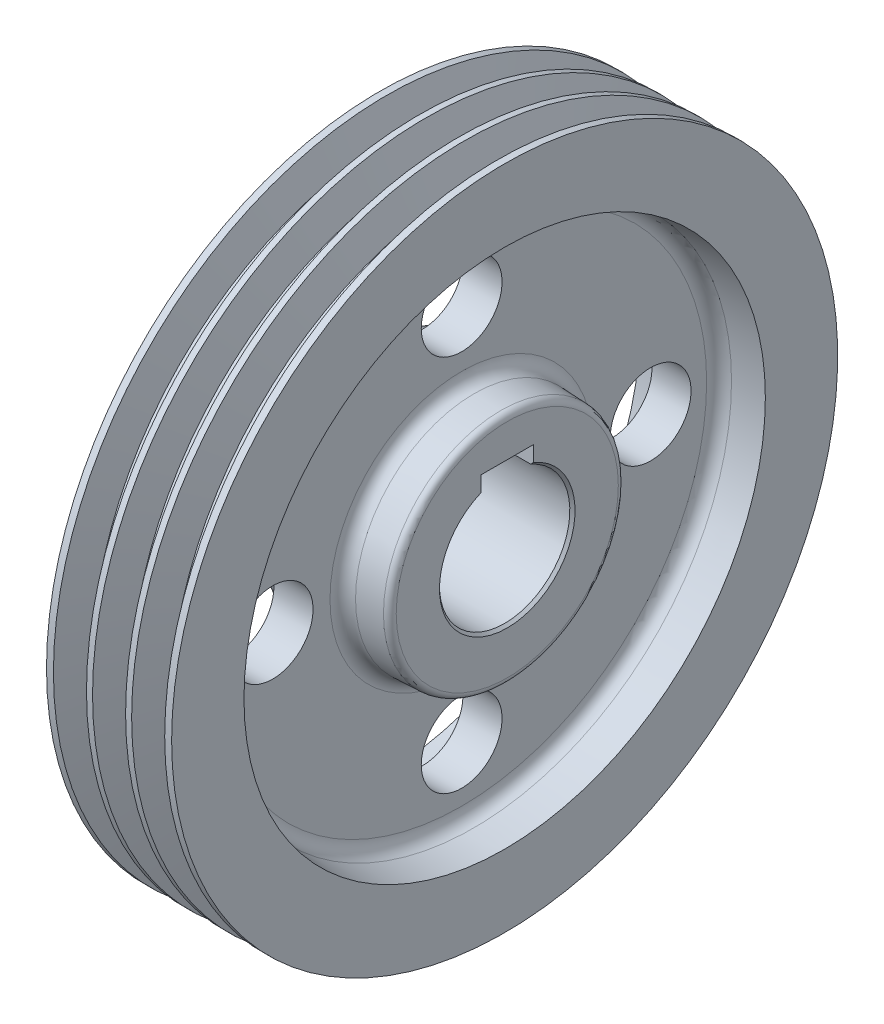
ISO-10303-21;
HEADER;
FILE_DESCRIPTION(('STEP AP214'),'2;1');
FILE_NAME('part.step','',(''),(''),'','','');
FILE_SCHEMA(('AUTOMOTIVE_DESIGN { 1 0 10303 214 1 1 1 1 }'));
ENDSEC;
DATA;
#1=APPLICATION_CONTEXT('core data for automotive mechanical design processes');
#2=APPLICATION_PROTOCOL_DEFINITION('international standard','automotive_design',2000,#1);
#3=PRODUCT_CONTEXT('',#1,'mechanical');
#4=PRODUCT('Part','Part','',(#3));
#5=PRODUCT_RELATED_PRODUCT_CATEGORY('part','',(#4));
#6=PRODUCT_DEFINITION_FORMATION('','',#4);
#7=PRODUCT_DEFINITION_CONTEXT('part definition',#1,'design');
#8=PRODUCT_DEFINITION('design','',#6,#7);
#9=PRODUCT_DEFINITION_SHAPE('','',#8);
#10=(LENGTH_UNIT() NAMED_UNIT(*) SI_UNIT(.MILLI.,.METRE.));
#11=(NAMED_UNIT(*) PLANE_ANGLE_UNIT() SI_UNIT($,.RADIAN.));
#12=(NAMED_UNIT(*) SI_UNIT($,.STERADIAN.) SOLID_ANGLE_UNIT());
#13=UNCERTAINTY_MEASURE_WITH_UNIT(LENGTH_MEASURE(1.E-05),#10,'distance_accuracy_value','');
#14=(GEOMETRIC_REPRESENTATION_CONTEXT(3) GLOBAL_UNCERTAINTY_ASSIGNED_CONTEXT((#13)) GLOBAL_UNIT_ASSIGNED_CONTEXT((#10,
#11,#12)) REPRESENTATION_CONTEXT('',''));
#15=CARTESIAN_POINT('',(0.,0.,0.));
#16=DIRECTION('',(0.,0.,1.));
#17=DIRECTION('',(1.,0.,0.));
#18=AXIS2_PLACEMENT_3D('',#15,#16,#17);
#19=CARTESIAN_POINT('',(16.5,46.5310516117034,0.));
#20=DIRECTION('',(1.,0.,0.));
#21=DIRECTION('',(0.,0.,-1.));
#22=AXIS2_PLACEMENT_3D('',#19,#20,#21);
#23=PLANE('',#22);
#24=CARTESIAN_POINT('',(16.5,-72.5,5.06264794132254E-13));
#25=DIRECTION('',(1.,0.,0.));
#26=DIRECTION('',(0.,0.,-1.));
#27=AXIS2_PLACEMENT_3D('',#24,#25,#26);
#28=CIRCLE('',#27,15.5);
#29=CARTESIAN_POINT('',(16.5,-72.5,-15.4999999999995));
#30=VERTEX_POINT('',#29);
#31=EDGE_CURVE('E330',#30,#30,#28,.F.);
#32=ORIENTED_EDGE('',*,*,#31,.F.);
#33=EDGE_LOOP('',(#32));
#34=FACE_BOUND('',#33,.T.);
#35=CARTESIAN_POINT('',(16.5,72.5,0.));
#36=DIRECTION('',(1.,0.,0.));
#37=DIRECTION('',(0.,0.,-1.));
#38=AXIS2_PLACEMENT_3D('',#35,#36,#37);
#39=CIRCLE('',#38,15.5);
#40=CARTESIAN_POINT('',(16.5,72.5,-15.5));
#41=VERTEX_POINT('',#40);
#42=EDGE_CURVE('E116',#41,#41,#39,.F.);
#43=ORIENTED_EDGE('',*,*,#42,.F.);
#44=EDGE_LOOP('',(#43));
#45=FACE_BOUND('',#44,.T.);
#46=CARTESIAN_POINT('',(16.5,0.,0.));
#47=DIRECTION('',(1.,0.,0.));
#48=DIRECTION('',(0.,0.,-1.));
#49=AXIS2_PLACEMENT_3D('',#46,#47,#48);
#50=CIRCLE('',#49,51.1127074817906);
#51=CARTESIAN_POINT('',(16.5,0.,-51.1127074817906));
#52=VERTEX_POINT('',#51);
#53=EDGE_CURVE('E296',#52,#52,#50,.T.);
#54=ORIENTED_EDGE('',*,*,#53,.T.);
#55=EDGE_LOOP('',(#54));
#56=FACE_BOUND('',#55,.T.);
#57=CARTESIAN_POINT('',(16.5,0.,0.));
#58=DIRECTION('',(1.,0.,0.));
#59=DIRECTION('',(0.,0.,-1.));
#60=AXIS2_PLACEMENT_3D('',#57,#58,#59);
#61=CIRCLE('',#60,94.5361263688525);
#62=CARTESIAN_POINT('',(16.5,0.,-94.5361263688525));
#63=VERTEX_POINT('',#62);
#64=EDGE_CURVE('E292',#63,#63,#61,.F.);
#65=ORIENTED_EDGE('',*,*,#64,.T.);
#66=EDGE_LOOP('',(#65));
#67=FACE_BOUND('',#66,.T.);
#68=CARTESIAN_POINT('',(16.5,-2.53132397066127E-13,-72.5));
#69=DIRECTION('',(1.,0.,0.));
#70=DIRECTION('',(0.,0.,-1.));
#71=AXIS2_PLACEMENT_3D('',#68,#69,#70);
#72=CIRCLE('',#71,15.5);
#73=CARTESIAN_POINT('',(16.5,-2.53132397066127E-13,-88.));
#74=VERTEX_POINT('',#73);
#75=EDGE_CURVE('E327',#74,#74,#72,.F.);
#76=ORIENTED_EDGE('',*,*,#75,.F.);
#77=EDGE_LOOP('',(#76));
#78=FACE_BOUND('',#77,.T.);
#79=CARTESIAN_POINT('',(16.5,7.59397191198382E-13,72.5));
#80=DIRECTION('',(1.,0.,0.));
#81=DIRECTION('',(0.,0.,-1.));
#82=AXIS2_PLACEMENT_3D('',#79,#80,#81);
#83=CIRCLE('',#82,15.5);
#84=CARTESIAN_POINT('',(16.5,7.59397191198382E-13,57.));
#85=VERTEX_POINT('',#84);
#86=EDGE_CURVE('E333',#85,#85,#83,.F.);
#87=ORIENTED_EDGE('',*,*,#86,.F.);
#88=EDGE_LOOP('',(#87));
#89=FACE_BOUND('',#88,.T.);
#90=ADVANCED_FACE('F33',(#34,#45,#56,#67,#78,#89),#23,.F.);
#91=CARTESIAN_POINT('',(31.5,98.5564370518225,0.));
#92=DIRECTION('',(-1.,0.,0.));
#93=DIRECTION('',(0.,0.,1.));
#94=AXIS2_PLACEMENT_3D('',#91,#92,#93);
#95=PLANE('',#94);
#96=CARTESIAN_POINT('',(31.5,-72.5,5.06264794132254E-13));
#97=DIRECTION('',(-1.,0.,0.));
#98=DIRECTION('',(0.,0.,1.));
#99=AXIS2_PLACEMENT_3D('',#96,#97,#98);
#100=CIRCLE('',#99,15.5);
#101=CARTESIAN_POINT('',(31.5,-72.5,15.5000000000005));
#102=VERTEX_POINT('',#101);
#103=EDGE_CURVE('E331',#102,#102,#100,.F.);
#104=ORIENTED_EDGE('',*,*,#103,.F.);
#105=EDGE_LOOP('',(#104));
#106=FACE_BOUND('',#105,.T.);
#107=CARTESIAN_POINT('',(31.5,72.5,0.));
#108=DIRECTION('',(-1.,0.,0.));
#109=DIRECTION('',(0.,0.,1.));
#110=AXIS2_PLACEMENT_3D('',#107,#108,#109);
#111=CIRCLE('',#110,15.5);
#112=CARTESIAN_POINT('',(31.5,72.5,15.5));
#113=VERTEX_POINT('',#112);
#114=EDGE_CURVE('E324',#113,#113,#111,.F.);
#115=ORIENTED_EDGE('',*,*,#114,.F.);
#116=EDGE_LOOP('',(#115));
#117=FACE_BOUND('',#116,.T.);
#118=CARTESIAN_POINT('',(31.5,0.,0.));
#119=DIRECTION('',(-1.,0.,0.));
#120=DIRECTION('',(0.,0.,1.));
#121=AXIS2_PLACEMENT_3D('',#118,#119,#120);
#122=CIRCLE('',#121,50.5038629668638);
#123=CARTESIAN_POINT('',(31.5,0.,50.5038629668638));
#124=VERTEX_POINT('',#123);
#125=EDGE_CURVE('E307',#124,#124,#122,.T.);
#126=ORIENTED_EDGE('',*,*,#125,.T.);
#127=EDGE_LOOP('',(#126));
#128=FACE_BOUND('',#127,.T.);
#129=CARTESIAN_POINT('',(31.5,0.,0.));
#130=DIRECTION('',(-1.,0.,0.));
#131=DIRECTION('',(0.,0.,1.));
#132=AXIS2_PLACEMENT_3D('',#129,#130,#131);
#133=CIRCLE('',#132,93.9747811817353);
#134=CARTESIAN_POINT('',(31.5,0.,93.9747811817353));
#135=VERTEX_POINT('',#134);
#136=EDGE_CURVE('E304',#135,#135,#133,.F.);
#137=ORIENTED_EDGE('',*,*,#136,.T.);
#138=EDGE_LOOP('',(#137));
#139=FACE_BOUND('',#138,.T.);
#140=CARTESIAN_POINT('',(31.5,-2.53132397066127E-13,-72.5));
#141=DIRECTION('',(-1.,0.,0.));
#142=DIRECTION('',(0.,0.,1.));
#143=AXIS2_PLACEMENT_3D('',#140,#141,#142);
#144=CIRCLE('',#143,15.5);
#145=CARTESIAN_POINT('',(31.5,-2.53132397066127E-13,-57.));
#146=VERTEX_POINT('',#145);
#147=EDGE_CURVE('E328',#146,#146,#144,.F.);
#148=ORIENTED_EDGE('',*,*,#147,.F.);
#149=EDGE_LOOP('',(#148));
#150=FACE_BOUND('',#149,.T.);
#151=CARTESIAN_POINT('',(31.5,7.59397191198382E-13,72.5));
#152=DIRECTION('',(-1.,0.,0.));
#153=DIRECTION('',(0.,0.,1.));
#154=AXIS2_PLACEMENT_3D('',#151,#152,#153);
#155=CIRCLE('',#154,15.5);
#156=CARTESIAN_POINT('',(31.5,7.59397191198382E-13,88.));
#157=VERTEX_POINT('',#156);
#158=EDGE_CURVE('E37',#157,#157,#155,.F.);
#159=ORIENTED_EDGE('',*,*,#158,.F.);
#160=EDGE_LOOP('',(#159));
#161=FACE_BOUND('',#160,.T.);
#162=ADVANCED_FACE('F193',(#106,#117,#128,#139,#150,#161),#95,.F.);
#163=CARTESIAN_POINT('',(0.,0.,0.));
#164=DIRECTION('',(-1.,0.,0.));
#165=DIRECTION('',(0.,0.,1.));
#166=AXIS2_PLACEMENT_3D('',#163,#164,#165);
#167=CYLINDRICAL_SURFACE('',#166,127.75);
#168=CARTESIAN_POINT('',(48.,0.,0.));
#169=DIRECTION('',(-1.,0.,0.));
#170=DIRECTION('',(0.,0.,1.));
#171=AXIS2_PLACEMENT_3D('',#168,#169,#170);
#172=CIRCLE('',#171,127.75);
#173=CARTESIAN_POINT('',(48.,0.,127.75));
#174=VERTEX_POINT('',#173);
#175=EDGE_CURVE('E245',#174,#174,#172,.T.);
#176=ORIENTED_EDGE('',*,*,#175,.T.);
#177=EDGE_LOOP('',(#176));
#178=FACE_BOUND('',#177,.T.);
#179=CARTESIAN_POINT('',(45.3407593740113,0.,0.));
#180=DIRECTION('',(-1.,0.,0.));
#181=DIRECTION('',(0.,0.,1.));
#182=AXIS2_PLACEMENT_3D('',#179,#180,#181);
#183=CIRCLE('',#182,127.75);
#184=CARTESIAN_POINT('',(45.3407593740113,0.,127.75));
#185=VERTEX_POINT('',#184);
#186=EDGE_CURVE('E278',#185,#185,#183,.T.);
#187=ORIENTED_EDGE('',*,*,#186,.F.);
#188=EDGE_LOOP('',(#187));
#189=FACE_BOUND('',#188,.T.);
#190=ADVANCED_FACE('F199',(#178,#189),#167,.T.);
#191=CARTESIAN_POINT('',(30.3407593740113,0.,0.));
#192=DIRECTION('',(-1.,0.,0.));
#193=DIRECTION('',(0.,0.,1.));
#194=AXIS2_PLACEMENT_3D('',#191,#192,#193);
#195=CIRCLE('',#194,127.75);
#196=CARTESIAN_POINT('',(30.3407593740113,0.,127.75));
#197=VERTEX_POINT('',#196);
#198=EDGE_CURVE('E266',#197,#197,#195,.T.);
#199=ORIENTED_EDGE('',*,*,#198,.F.);
#200=EDGE_LOOP('',(#199));
#201=FACE_BOUND('',#200,.T.);
#202=CARTESIAN_POINT('',(32.6592406259887,0.,0.));
#203=DIRECTION('',(-1.,0.,0.));
#204=DIRECTION('',(0.,0.,1.));
#205=AXIS2_PLACEMENT_3D('',#202,#203,#204);
#206=CIRCLE('',#205,127.75);
#207=CARTESIAN_POINT('',(32.6592406259887,0.,127.75));
#208=VERTEX_POINT('',#207);
#209=EDGE_CURVE('E281',#208,#208,#206,.T.);
#210=ORIENTED_EDGE('',*,*,#209,.T.);
#211=EDGE_LOOP('',(#210));
#212=FACE_BOUND('',#211,.T.);
#213=ADVANCED_FACE('F543',(#201,#212),#167,.T.);
#214=CARTESIAN_POINT('',(15.3407593740113,0.,0.));
#215=DIRECTION('',(-1.,0.,0.));
#216=DIRECTION('',(0.,0.,1.));
#217=AXIS2_PLACEMENT_3D('',#214,#215,#216);
#218=CIRCLE('',#217,127.75);
#219=CARTESIAN_POINT('',(15.3407593740113,0.,127.75));
#220=VERTEX_POINT('',#219);
#221=EDGE_CURVE('E254',#220,#220,#218,.T.);
#222=ORIENTED_EDGE('',*,*,#221,.F.);
#223=EDGE_LOOP('',(#222));
#224=FACE_BOUND('',#223,.T.);
#225=CARTESIAN_POINT('',(17.6592406259887,0.,0.));
#226=DIRECTION('',(-1.,0.,0.));
#227=DIRECTION('',(0.,0.,1.));
#228=AXIS2_PLACEMENT_3D('',#225,#226,#227);
#229=CIRCLE('',#228,127.75);
#230=CARTESIAN_POINT('',(17.6592406259887,0.,127.75));
#231=VERTEX_POINT('',#230);
#232=EDGE_CURVE('E269',#231,#231,#229,.T.);
#233=ORIENTED_EDGE('',*,*,#232,.T.);
#234=EDGE_LOOP('',(#233));
#235=FACE_BOUND('',#234,.T.);
#236=ADVANCED_FACE('F222',(#224,#235),#167,.T.);
#237=CARTESIAN_POINT('',(0.,0.,0.));
#238=DIRECTION('',(-1.,0.,0.));
#239=DIRECTION('',(0.,0.,1.));
#240=AXIS2_PLACEMENT_3D('',#237,#238,#239);
#241=CIRCLE('',#240,127.75);
#242=CARTESIAN_POINT('',(0.,0.,127.75));
#243=VERTEX_POINT('',#242);
#244=EDGE_CURVE('E242',#243,#243,#241,.T.);
#245=ORIENTED_EDGE('',*,*,#244,.F.);
#246=EDGE_LOOP('',(#245));
#247=FACE_BOUND('',#246,.T.);
#248=CARTESIAN_POINT('',(2.65924062598869,0.,0.));
#249=DIRECTION('',(-1.,0.,0.));
#250=DIRECTION('',(0.,0.,1.));
#251=AXIS2_PLACEMENT_3D('',#248,#249,#250);
#252=CIRCLE('',#251,127.75);
#253=CARTESIAN_POINT('',(2.65924062598869,0.,127.75));
#254=VERTEX_POINT('',#253);
#255=EDGE_CURVE('E257',#254,#254,#252,.T.);
#256=ORIENTED_EDGE('',*,*,#255,.T.);
#257=EDGE_LOOP('',(#256));
#258=FACE_BOUND('',#257,.T.);
#259=ADVANCED_FACE('F217',(#247,#258),#167,.T.);
#260=CARTESIAN_POINT('',(0.,0.,0.));
#261=DIRECTION('',(-1.,0.,0.));
#262=DIRECTION('',(0.,0.,1.));
#263=AXIS2_PLACEMENT_3D('',#260,#261,#262);
#264=CYLINDRICAL_SURFACE('',#263,25.);
#265=CARTESIAN_POINT('',(0.,0.,0.));
#266=DIRECTION('',(1.,0.,0.));
#267=DIRECTION('',(0.,0.,-1.));
#268=AXIS2_PLACEMENT_3D('',#265,#266,#267);
#269=CIRCLE('',#268,25.);
#270=CARTESIAN_POINT('',(0.,22.9128784747792,-10.));
#271=VERTEX_POINT('',#270);
#272=CARTESIAN_POINT('',(0.,22.9128784747792,10.));
#273=VERTEX_POINT('',#272);
#274=EDGE_CURVE('E228',#271,#273,#269,.F.);
#275=ORIENTED_EDGE('',*,*,#274,.T.);
#276=DIRECTION('',(-1.,0.,0.));
#277=VECTOR('',#276,1.);
#278=CARTESIAN_POINT('',(49.,22.9128784747792,10.));
#279=LINE('',#278,#277);
#280=CARTESIAN_POINT('',(48.,22.9128784747792,10.));
#281=VERTEX_POINT('',#280);
#282=EDGE_CURVE('E95',#281,#273,#279,.T.);
#283=ORIENTED_EDGE('',*,*,#282,.F.);
#284=CARTESIAN_POINT('',(48.,0.,0.));
#285=DIRECTION('',(-1.,0.,0.));
#286=DIRECTION('',(0.,0.,1.));
#287=AXIS2_PLACEMENT_3D('',#284,#285,#286);
#288=CIRCLE('',#287,25.);
#289=CARTESIAN_POINT('',(48.,22.9128784747792,-10.));
#290=VERTEX_POINT('',#289);
#291=EDGE_CURVE('E234',#281,#290,#288,.F.);
#292=ORIENTED_EDGE('',*,*,#291,.T.);
#293=DIRECTION('',(-1.,0.,0.));
#294=VECTOR('',#293,1.);
#295=CARTESIAN_POINT('',(49.,22.9128784747792,-10.));
#296=LINE('',#295,#294);
#297=EDGE_CURVE('E103',#290,#271,#296,.T.);
#298=ORIENTED_EDGE('',*,*,#297,.T.);
#299=EDGE_LOOP('',(#275,#283,#292,#298));
#300=FACE_BOUND('',#299,.T.);
#301=ADVANCED_FACE('F214',(#300),#264,.F.);
#302=CARTESIAN_POINT('',(-1.,25.,0.));
#303=DIRECTION('',(1.,0.,0.));
#304=DIRECTION('',(0.,0.,-1.));
#305=AXIS2_PLACEMENT_3D('',#302,#303,#304);
#306=PLANE('',#305);
#307=CARTESIAN_POINT('',(-1.,0.,0.));
#308=DIRECTION('',(1.,0.,0.));
#309=DIRECTION('',(0.,0.,-1.));
#310=AXIS2_PLACEMENT_3D('',#307,#308,#309);
#311=CIRCLE('',#310,42.7091720649564);
#312=CARTESIAN_POINT('',(-1.,0.,-42.7091720649564));
#313=VERTEX_POINT('',#312);
#314=EDGE_CURVE('E42',#313,#313,#311,.F.);
#315=ORIENTED_EDGE('',*,*,#314,.T.);
#316=EDGE_LOOP('',(#315));
#317=FACE_BOUND('',#316,.T.);
#318=CARTESIAN_POINT('',(-1.,0.,0.));
#319=DIRECTION('',(1.,0.,0.));
#320=DIRECTION('',(0.,0.,-1.));
#321=AXIS2_PLACEMENT_3D('',#318,#319,#320);
#322=CIRCLE('',#321,26.);
#323=CARTESIAN_POINT('',(-1.,24.,10.));
#324=VERTEX_POINT('',#323);
#325=CARTESIAN_POINT('',(-1.,24.,-10.));
#326=VERTEX_POINT('',#325);
#327=EDGE_CURVE('E233',#324,#326,#322,.T.);
#328=ORIENTED_EDGE('',*,*,#327,.T.);
#329=DIRECTION('',(0.,-1.,0.));
#330=VECTOR('',#329,1.);
#331=CARTESIAN_POINT('',(-1.,22.9128784747792,-10.));
#332=LINE('',#331,#330);
#333=CARTESIAN_POINT('',(-1.,29.9,-10.));
#334=VERTEX_POINT('',#333);
#335=EDGE_CURVE('E58',#334,#326,#332,.T.);
#336=ORIENTED_EDGE('',*,*,#335,.F.);
#337=DIRECTION('',(0.,0.,-1.));
#338=VECTOR('',#337,1.);
#339=CARTESIAN_POINT('',(-1.,29.9,-10.));
#340=LINE('',#339,#338);
#341=CARTESIAN_POINT('',(-1.,29.9,10.));
#342=VERTEX_POINT('',#341);
#343=EDGE_CURVE('E111',#342,#334,#340,.T.);
#344=ORIENTED_EDGE('',*,*,#343,.F.);
#345=DIRECTION('',(0.,1.,0.));
#346=VECTOR('',#345,1.);
#347=CARTESIAN_POINT('',(-1.,22.9128784747792,10.));
#348=LINE('',#347,#346);
#349=EDGE_CURVE('E90',#324,#342,#348,.T.);
#350=ORIENTED_EDGE('',*,*,#349,.F.);
#351=EDGE_LOOP('',(#328,#336,#344,#350));
#352=FACE_BOUND('',#351,.T.);
#353=ADVANCED_FACE('F211',(#317,#352),#306,.F.);
#354=CARTESIAN_POINT('',(16.5,0.,0.));
#355=DIRECTION('',(1.,0.,0.));
#356=DIRECTION('',(0.,0.,-1.));
#357=AXIS2_PLACEMENT_3D('',#354,#355,#356);
#358=CONICAL_SURFACE('',#357,46.5310516117034,0.0872664625997025);
#359=CARTESIAN_POINT('',(1.282110643131,0.,0.));
#360=DIRECTION('',(-1.,0.,0.));
#361=DIRECTION('',(0.,0.,1.));
#362=AXIS2_PLACEMENT_3D('',#359,#360,#361);
#363=CIRCLE('',#362,45.1996588101858);
#364=CARTESIAN_POINT('',(1.282110643131,0.,45.1996588101858));
#365=VERTEX_POINT('',#364);
#366=EDGE_CURVE('E11',#365,#365,#363,.F.);
#367=ORIENTED_EDGE('',*,*,#366,.T.);
#368=EDGE_LOOP('',(#367));
#369=FACE_BOUND('',#368,.T.);
#370=CARTESIAN_POINT('',(11.9357787137382,0.,0.));
#371=DIRECTION('',(1.,0.,0.));
#372=DIRECTION('',(0.,0.,-1.));
#373=AXIS2_PLACEMENT_3D('',#370,#371,#372);
#374=CIRCLE('',#373,46.1317339913319);
#375=CARTESIAN_POINT('',(11.9357787137382,0.,-46.1317339913319));
#376=VERTEX_POINT('',#375);
#377=EDGE_CURVE('E290',#376,#376,#374,.F.);
#378=ORIENTED_EDGE('',*,*,#377,.T.);
#379=EDGE_LOOP('',(#378));
#380=FACE_BOUND('',#379,.T.);
#381=ADVANCED_FACE('F208',(#369,#380),#358,.T.);
#382=CARTESIAN_POINT('',(0.,0.,0.));
#383=DIRECTION('',(-1.,0.,0.));
#384=DIRECTION('',(0.,0.,1.));
#385=AXIS2_PLACEMENT_3D('',#382,#383,#384);
#386=CONICAL_SURFACE('',#385,100.,0.0399680398706699);
#387=CARTESIAN_POINT('',(11.6997869980079,0.,0.));
#388=DIRECTION('',(-1.,0.,0.));
#389=DIRECTION('',(0.,0.,1.));
#390=AXIS2_PLACEMENT_3D('',#387,#388,#389);
#391=CIRCLE('',#390,99.5321332899273);
#392=CARTESIAN_POINT('',(11.6997869980079,0.,99.5321332899273));
#393=VERTEX_POINT('',#392);
#394=EDGE_CURVE('E301',#393,#393,#391,.F.);
#395=ORIENTED_EDGE('',*,*,#394,.T.);
#396=EDGE_LOOP('',(#395));
#397=FACE_BOUND('',#396,.T.);
#398=CARTESIAN_POINT('',(0.,0.,0.));
#399=DIRECTION('',(-1.,0.,0.));
#400=DIRECTION('',(0.,0.,1.));
#401=AXIS2_PLACEMENT_3D('',#398,#399,#400);
#402=CIRCLE('',#401,100.);
#403=CARTESIAN_POINT('',(0.,0.,100.));
#404=VERTEX_POINT('',#403);
#405=EDGE_CURVE('E237',#404,#404,#402,.T.);
#406=ORIENTED_EDGE('',*,*,#405,.T.);
#407=EDGE_LOOP('',(#406));
#408=FACE_BOUND('',#407,.T.);
#409=ADVANCED_FACE('F206',(#397,#408),#386,.F.);
#410=CARTESIAN_POINT('',(0.,100.,0.));
#411=DIRECTION('',(1.,0.,0.));
#412=DIRECTION('',(0.,0.,-1.));
#413=AXIS2_PLACEMENT_3D('',#410,#411,#412);
#414=PLANE('',#413);
#415=ORIENTED_EDGE('',*,*,#405,.F.);
#416=EDGE_LOOP('',(#415));
#417=FACE_BOUND('',#416,.T.);
#418=ORIENTED_EDGE('',*,*,#244,.T.);
#419=EDGE_LOOP('',(#418));
#420=FACE_BOUND('',#419,.T.);
#421=ADVANCED_FACE('F616',(#417,#420),#414,.F.);
#422=CARTESIAN_POINT('',(48.,127.75,0.));
#423=DIRECTION('',(-1.,0.,0.));
#424=DIRECTION('',(0.,0.,1.));
#425=AXIS2_PLACEMENT_3D('',#422,#423,#424);
#426=PLANE('',#425);
#427=ORIENTED_EDGE('',*,*,#175,.F.);
#428=EDGE_LOOP('',(#427));
#429=FACE_BOUND('',#428,.T.);
#430=CARTESIAN_POINT('',(48.,0.,0.));
#431=DIRECTION('',(-1.,0.,0.));
#432=DIRECTION('',(0.,0.,1.));
#433=AXIS2_PLACEMENT_3D('',#430,#431,#432);
#434=CIRCLE('',#433,100.);
#435=CARTESIAN_POINT('',(48.,0.,100.));
#436=VERTEX_POINT('',#435);
#437=EDGE_CURVE('E248',#436,#436,#434,.T.);
#438=ORIENTED_EDGE('',*,*,#437,.T.);
#439=EDGE_LOOP('',(#438));
#440=FACE_BOUND('',#439,.T.);
#441=ADVANCED_FACE('F567',(#429,#440),#426,.F.);
#442=CARTESIAN_POINT('',(31.5,0.,0.));
#443=DIRECTION('',(1.,0.,0.));
#444=DIRECTION('',(0.,0.,-1.));
#445=AXIS2_PLACEMENT_3D('',#442,#443,#444);
#446=CONICAL_SURFACE('',#445,98.5564370518225,0.0872664625997028);
#447=CARTESIAN_POINT('',(36.0642212862618,0.,0.));
#448=DIRECTION('',(1.,0.,0.));
#449=DIRECTION('',(0.,0.,-1.));
#450=AXIS2_PLACEMENT_3D('',#447,#448,#449);
#451=CIRCLE('',#450,98.9557546721941);
#452=CARTESIAN_POINT('',(36.0642212862618,0.,-98.9557546721941));
#453=VERTEX_POINT('',#452);
#454=EDGE_CURVE('E313',#453,#453,#451,.F.);
#455=ORIENTED_EDGE('',*,*,#454,.T.);
#456=EDGE_LOOP('',(#455));
#457=FACE_BOUND('',#456,.T.);
#458=ORIENTED_EDGE('',*,*,#437,.F.);
#459=EDGE_LOOP('',(#458));
#460=FACE_BOUND('',#459,.T.);
#461=ADVANCED_FACE('F610',(#457,#460),#446,.F.);
#462=CARTESIAN_POINT('',(49.,0.,0.));
#463=DIRECTION('',(-1.,0.,0.));
#464=DIRECTION('',(0.,0.,1.));
#465=AXIS2_PLACEMENT_3D('',#462,#463,#464);
#466=CONICAL_SURFACE('',#465,45.,0.0399680398706701);
#467=CARTESIAN_POINT('',(46.599893499004,0.,0.));
#468=DIRECTION('',(1.,0.,0.));
#469=DIRECTION('',(0.,0.,-1.));
#470=AXIS2_PLACEMENT_3D('',#467,#468,#469);
#471=CIRCLE('',#470,45.0959786646232);
#472=CARTESIAN_POINT('',(46.599893499004,0.,-45.0959786646232));
#473=VERTEX_POINT('',#472);
#474=EDGE_CURVE('E316',#473,#473,#471,.F.);
#475=ORIENTED_EDGE('',*,*,#474,.T.);
#476=EDGE_LOOP('',(#475));
#477=FACE_BOUND('',#476,.T.);
#478=CARTESIAN_POINT('',(36.3002130019921,0.,0.));
#479=DIRECTION('',(-1.,0.,0.));
#480=DIRECTION('',(0.,0.,1.));
#481=AXIS2_PLACEMENT_3D('',#478,#479,#480);
#482=CIRCLE('',#481,45.5078560457891);
#483=CARTESIAN_POINT('',(36.3002130019921,0.,45.5078560457891));
#484=VERTEX_POINT('',#483);
#485=EDGE_CURVE('E310',#484,#484,#482,.F.);
#486=ORIENTED_EDGE('',*,*,#485,.T.);
#487=EDGE_LOOP('',(#486));
#488=FACE_BOUND('',#487,.T.);
#489=ADVANCED_FACE('F607',(#477,#488),#466,.T.);
#490=CARTESIAN_POINT('',(49.,45.,0.));
#491=DIRECTION('',(-1.,0.,0.));
#492=DIRECTION('',(0.,0.,1.));
#493=AXIS2_PLACEMENT_3D('',#490,#491,#492);
#494=PLANE('',#493);
#495=CARTESIAN_POINT('',(49.,0.,0.));
#496=DIRECTION('',(-1.,0.,0.));
#497=DIRECTION('',(0.,0.,1.));
#498=AXIS2_PLACEMENT_3D('',#495,#496,#497);
#499=CIRCLE('',#498,42.5979752040859);
#500=CARTESIAN_POINT('',(49.,0.,42.5979752040859));
#501=VERTEX_POINT('',#500);
#502=EDGE_CURVE('E319',#501,#501,#499,.F.);
#503=ORIENTED_EDGE('',*,*,#502,.T.);
#504=EDGE_LOOP('',(#503));
#505=FACE_BOUND('',#504,.T.);
#506=DIRECTION('',(0.,0.,-1.));
#507=VECTOR('',#506,1.);
#508=CARTESIAN_POINT('',(49.,29.9,-10.));
#509=LINE('',#508,#507);
#510=CARTESIAN_POINT('',(49.,29.9,10.));
#511=VERTEX_POINT('',#510);
#512=CARTESIAN_POINT('',(49.,29.9,-10.));
#513=VERTEX_POINT('',#512);
#514=EDGE_CURVE('E98',#511,#513,#509,.T.);
#515=ORIENTED_EDGE('',*,*,#514,.T.);
#516=DIRECTION('',(0.,-1.,0.));
#517=VECTOR('',#516,1.);
#518=CARTESIAN_POINT('',(49.,22.9128784747792,-10.));
#519=LINE('',#518,#517);
#520=CARTESIAN_POINT('',(49.,23.9999999999999,-10.));
#521=VERTEX_POINT('',#520);
#522=EDGE_CURVE('E109',#513,#521,#519,.T.);
#523=ORIENTED_EDGE('',*,*,#522,.T.);
#524=CARTESIAN_POINT('',(49.,0.,0.));
#525=DIRECTION('',(-1.,0.,0.));
#526=DIRECTION('',(0.,0.,1.));
#527=AXIS2_PLACEMENT_3D('',#524,#525,#526);
#528=CIRCLE('',#527,25.9999999999999);
#529=CARTESIAN_POINT('',(49.,23.9999999999999,10.));
#530=VERTEX_POINT('',#529);
#531=EDGE_CURVE('E108',#521,#530,#528,.T.);
#532=ORIENTED_EDGE('',*,*,#531,.T.);
#533=DIRECTION('',(0.,1.,0.));
#534=VECTOR('',#533,1.);
#535=CARTESIAN_POINT('',(49.,22.9128784747792,10.));
#536=LINE('',#535,#534);
#537=EDGE_CURVE('E50',#530,#511,#536,.T.);
#538=ORIENTED_EDGE('',*,*,#537,.T.);
#539=EDGE_LOOP('',(#515,#523,#532,#538));
#540=FACE_BOUND('',#539,.T.);
#541=ADVANCED_FACE('F106',(#505,#540),#494,.F.);
#542=CARTESIAN_POINT('',(0.,0.,0.));
#543=DIRECTION('',(-1.,0.,0.));
#544=DIRECTION('',(0.,0.,1.));
#545=AXIS2_PLACEMENT_3D('',#542,#543,#544);
#546=CYLINDRICAL_SURFACE('',#545,116.3);
#547=CARTESIAN_POINT('',(11.8401430713097,0.,0.));
#548=DIRECTION('',(-1.,0.,0.));
#549=DIRECTION('',(0.,0.,1.));
#550=AXIS2_PLACEMENT_3D('',#547,#548,#549);
#551=CIRCLE('',#550,116.3);
#552=CARTESIAN_POINT('',(11.8401430713097,0.,116.3));
#553=VERTEX_POINT('',#552);
#554=EDGE_CURVE('E251',#553,#553,#551,.T.);
#555=ORIENTED_EDGE('',*,*,#554,.T.);
#556=EDGE_LOOP('',(#555));
#557=FACE_BOUND('',#556,.T.);
#558=CARTESIAN_POINT('',(6.15985692869032,0.,0.));
#559=DIRECTION('',(-1.,0.,0.));
#560=DIRECTION('',(0.,0.,1.));
#561=AXIS2_PLACEMENT_3D('',#558,#559,#560);
#562=CIRCLE('',#561,116.3);
#563=CARTESIAN_POINT('',(6.15985692869032,0.,116.3));
#564=VERTEX_POINT('',#563);
#565=EDGE_CURVE('E260',#564,#564,#562,.T.);
#566=ORIENTED_EDGE('',*,*,#565,.F.);
#567=EDGE_LOOP('',(#566));
#568=FACE_BOUND('',#567,.T.);
#569=ADVANCED_FACE('F572',(#557,#568),#546,.T.);
#570=CARTESIAN_POINT('',(11.8401430713097,0.,0.));
#571=DIRECTION('',(1.,0.,0.));
#572=DIRECTION('',(0.,0.,-1.));
#573=AXIS2_PLACEMENT_3D('',#570,#571,#572);
#574=CONICAL_SURFACE('',#573,116.3,1.27409035395586);
#575=ORIENTED_EDGE('',*,*,#221,.T.);
#576=EDGE_LOOP('',(#575));
#577=FACE_BOUND('',#576,.T.);
#578=ORIENTED_EDGE('',*,*,#554,.F.);
#579=EDGE_LOOP('',(#578));
#580=FACE_BOUND('',#579,.T.);
#581=ADVANCED_FACE('F576',(#577,#580),#574,.T.);
#582=CARTESIAN_POINT('',(2.65924062598869,0.,0.));
#583=DIRECTION('',(-1.,0.,0.));
#584=DIRECTION('',(0.,0.,1.));
#585=AXIS2_PLACEMENT_3D('',#582,#583,#584);
#586=CONICAL_SURFACE('',#585,127.75,1.27409035395586);
#587=ORIENTED_EDGE('',*,*,#565,.T.);
#588=EDGE_LOOP('',(#587));
#589=FACE_BOUND('',#588,.T.);
#590=ORIENTED_EDGE('',*,*,#255,.F.);
#591=EDGE_LOOP('',(#590));
#592=FACE_BOUND('',#591,.T.);
#593=ADVANCED_FACE('F422',(#589,#592),#586,.T.);
#594=CARTESIAN_POINT('',(15.,0.,0.));
#595=DIRECTION('',(-1.,0.,0.));
#596=DIRECTION('',(0.,0.,1.));
#597=AXIS2_PLACEMENT_3D('',#594,#595,#596);
#598=CYLINDRICAL_SURFACE('',#597,116.3);
#599=CARTESIAN_POINT('',(26.8401430713097,0.,0.));
#600=DIRECTION('',(-1.,0.,0.));
#601=DIRECTION('',(0.,0.,1.));
#602=AXIS2_PLACEMENT_3D('',#599,#600,#601);
#603=CIRCLE('',#602,116.3);
#604=CARTESIAN_POINT('',(26.8401430713097,0.,116.3));
#605=VERTEX_POINT('',#604);
#606=EDGE_CURVE('E263',#605,#605,#603,.T.);
#607=ORIENTED_EDGE('',*,*,#606,.T.);
#608=EDGE_LOOP('',(#607));
#609=FACE_BOUND('',#608,.T.);
#610=CARTESIAN_POINT('',(21.1598569286903,0.,0.));
#611=DIRECTION('',(-1.,0.,0.));
#612=DIRECTION('',(0.,0.,1.));
#613=AXIS2_PLACEMENT_3D('',#610,#611,#612);
#614=CIRCLE('',#613,116.3);
#615=CARTESIAN_POINT('',(21.1598569286903,0.,116.3));
#616=VERTEX_POINT('',#615);
#617=EDGE_CURVE('E272',#616,#616,#614,.T.);
#618=ORIENTED_EDGE('',*,*,#617,.F.);
#619=EDGE_LOOP('',(#618));
#620=FACE_BOUND('',#619,.T.);
#621=ADVANCED_FACE('F417',(#609,#620),#598,.T.);
#622=CARTESIAN_POINT('',(26.8401430713097,0.,0.));
#623=DIRECTION('',(1.,0.,0.));
#624=DIRECTION('',(0.,0.,-1.));
#625=AXIS2_PLACEMENT_3D('',#622,#623,#624);
#626=CONICAL_SURFACE('',#625,116.3,1.27409035395586);
#627=ORIENTED_EDGE('',*,*,#198,.T.);
#628=EDGE_LOOP('',(#627));
#629=FACE_BOUND('',#628,.T.);
#630=ORIENTED_EDGE('',*,*,#606,.F.);
#631=EDGE_LOOP('',(#630));
#632=FACE_BOUND('',#631,.T.);
#633=ADVANCED_FACE('F395',(#629,#632),#626,.T.);
#634=CARTESIAN_POINT('',(17.6592406259887,0.,0.));
#635=DIRECTION('',(-1.,0.,0.));
#636=DIRECTION('',(0.,0.,1.));
#637=AXIS2_PLACEMENT_3D('',#634,#635,#636);
#638=CONICAL_SURFACE('',#637,127.75,1.27409035395586);
#639=ORIENTED_EDGE('',*,*,#617,.T.);
#640=EDGE_LOOP('',(#639));
#641=FACE_BOUND('',#640,.T.);
#642=ORIENTED_EDGE('',*,*,#232,.F.);
#643=EDGE_LOOP('',(#642));
#644=FACE_BOUND('',#643,.T.);
#645=ADVANCED_FACE('F389',(#641,#644),#638,.T.);
#646=CARTESIAN_POINT('',(30.,0.,0.));
#647=DIRECTION('',(-1.,0.,0.));
#648=DIRECTION('',(0.,0.,1.));
#649=AXIS2_PLACEMENT_3D('',#646,#647,#648);
#650=CYLINDRICAL_SURFACE('',#649,116.3);
#651=CARTESIAN_POINT('',(41.8401430713097,0.,0.));
#652=DIRECTION('',(-1.,0.,0.));
#653=DIRECTION('',(0.,0.,1.));
#654=AXIS2_PLACEMENT_3D('',#651,#652,#653);
#655=CIRCLE('',#654,116.3);
#656=CARTESIAN_POINT('',(41.8401430713097,0.,116.3));
#657=VERTEX_POINT('',#656);
#658=EDGE_CURVE('E275',#657,#657,#655,.T.);
#659=ORIENTED_EDGE('',*,*,#658,.T.);
#660=EDGE_LOOP('',(#659));
#661=FACE_BOUND('',#660,.T.);
#662=CARTESIAN_POINT('',(36.1598569286903,0.,0.));
#663=DIRECTION('',(-1.,0.,0.));
#664=DIRECTION('',(0.,0.,1.));
#665=AXIS2_PLACEMENT_3D('',#662,#663,#664);
#666=CIRCLE('',#665,116.3);
#667=CARTESIAN_POINT('',(36.1598569286903,0.,116.3));
#668=VERTEX_POINT('',#667);
#669=EDGE_CURVE('E283',#668,#668,#666,.T.);
#670=ORIENTED_EDGE('',*,*,#669,.F.);
#671=EDGE_LOOP('',(#670));
#672=FACE_BOUND('',#671,.T.);
#673=ADVANCED_FACE('F394',(#661,#672),#650,.T.);
#674=CARTESIAN_POINT('',(41.8401430713097,0.,0.));
#675=DIRECTION('',(1.,0.,0.));
#676=DIRECTION('',(0.,0.,-1.));
#677=AXIS2_PLACEMENT_3D('',#674,#675,#676);
#678=CONICAL_SURFACE('',#677,116.3,1.27409035395586);
#679=ORIENTED_EDGE('',*,*,#186,.T.);
#680=EDGE_LOOP('',(#679));
#681=FACE_BOUND('',#680,.T.);
#682=ORIENTED_EDGE('',*,*,#658,.F.);
#683=EDGE_LOOP('',(#682));
#684=FACE_BOUND('',#683,.T.);
#685=ADVANCED_FACE('F410',(#681,#684),#678,.T.);
#686=CARTESIAN_POINT('',(32.6592406259887,0.,0.));
#687=DIRECTION('',(-1.,0.,0.));
#688=DIRECTION('',(0.,0.,1.));
#689=AXIS2_PLACEMENT_3D('',#686,#687,#688);
#690=CONICAL_SURFACE('',#689,127.75,1.27409035395586);
#691=ORIENTED_EDGE('',*,*,#669,.T.);
#692=EDGE_LOOP('',(#691));
#693=FACE_BOUND('',#692,.T.);
#694=ORIENTED_EDGE('',*,*,#209,.F.);
#695=EDGE_LOOP('',(#694));
#696=FACE_BOUND('',#695,.T.);
#697=ADVANCED_FACE('F405',(#693,#696),#690,.T.);
#698=CARTESIAN_POINT('',(0.,0.,0.));
#699=DIRECTION('',(-1.,0.,0.));
#700=DIRECTION('',(0.,0.,1.));
#701=AXIS2_PLACEMENT_3D('',#698,#699,#700);
#702=CONICAL_SURFACE('',#701,25.,0.785398163397443);
#703=CARTESIAN_POINT('',(-4.72508401289114,27.9925100620404,-10.));
#704=CARTESIAN_POINT('',(-4.36428615410913,27.6093773862573,-10.));
#705=CARTESIAN_POINT('',(-4.00392869893594,27.2258304183999,-10.));
#706=CARTESIAN_POINT('',(-3.28421704281674,26.4577950415907,-10.));
#707=CARTESIAN_POINT('',(-2.92486284383299,26.0733066308002,-10.));
#708=CARTESIAN_POINT('',(-1.84853772028912,24.918312422088,-10.));
#709=CARTESIAN_POINT('',(-1.13325717053332,24.1462276969819,-10.));
#710=CARTESIAN_POINT('',(-0.0647538451639138,22.9840156125533,-10.));
#711=CARTESIAN_POINT('',(0.290683907954202,22.5959238730518,-10.));
#712=CARTESIAN_POINT('',(0.999845556466658,21.818178840576,-10.));
#713=CARTESIAN_POINT('',(1.35356945656006,21.4285255518884,-10.));
#714=CARTESIAN_POINT('',(2.05905479407671,20.6474008101355,-10.));
#715=CARTESIAN_POINT('',(2.41081610741735,20.2559292449156,-10.));
#716=CARTESIAN_POINT('',(3.11199783772515,19.4708888929116,-10.));
#717=CARTESIAN_POINT('',(3.46141823141774,19.0773200853455,-10.));
#718=CARTESIAN_POINT('',(3.80948660194246,18.6825549128929,-10.));
#719=B_SPLINE_CURVE_WITH_KNOTS('',3,(#703,#704,#705,#706,#707,#708,#709,#710,#711,#712,#713,
#714,#715,#716,#717,#718),.UNSPECIFIED.,.F.,.F.,(4,2,2,2,2,2,2,4),(0.,1.57882482091375,
3.15765272767388,6.31510258173963,7.89388318156083,9.47265945020889,11.0515344293257,
12.6304250831761),.UNSPECIFIED.);
#720=EDGE_CURVE('E130',#326,#271,#719,.T.);
#721=ORIENTED_EDGE('',*,*,#720,.F.);
#722=ORIENTED_EDGE('',*,*,#327,.F.);
#723=CARTESIAN_POINT('',(3.80948660194246,18.6825549128929,10.));
#724=CARTESIAN_POINT('',(3.46141823141774,19.0773200853455,10.));
#725=CARTESIAN_POINT('',(3.11199783772515,19.4708888929116,10.));
#726=CARTESIAN_POINT('',(2.41081610741735,20.2559292449156,10.));
#727=CARTESIAN_POINT('',(2.05905479407671,20.6474008101355,10.));
#728=CARTESIAN_POINT('',(1.35356945656006,21.4285255518884,10.));
#729=CARTESIAN_POINT('',(0.999845556466656,21.818178840576,10.));
#730=CARTESIAN_POINT('',(0.290683907954201,22.5959238730518,10.));
#731=CARTESIAN_POINT('',(-0.0647538451639146,22.9840156125533,10.));
#732=CARTESIAN_POINT('',(-1.13325717053332,24.1462276969819,10.));
#733=CARTESIAN_POINT('',(-1.84853772028912,24.9183124220879,10.));
#734=CARTESIAN_POINT('',(-2.92486284383299,26.0733066308002,10.));
#735=CARTESIAN_POINT('',(-3.28421704281674,26.4577950415907,10.));
#736=CARTESIAN_POINT('',(-4.00392869893594,27.2258304183999,10.));
#737=CARTESIAN_POINT('',(-4.36428615410913,27.6093773862573,10.));
#738=CARTESIAN_POINT('',(-4.72508401289114,27.9925100620404,10.));
#739=B_SPLINE_CURVE_WITH_KNOTS('',3,(#723,#724,#725,#726,#727,#728,#729,#730,#731,#732,#733,
#734,#735,#736,#737,#738),.UNSPECIFIED.,.F.,.F.,(4,2,2,2,2,2,2,4),(0.,1.57889065385041,
3.1577656329672,4.73654190161526,6.31532250143646,9.4727723555022,11.0516002622623,
12.6304250831761),.UNSPECIFIED.);
#740=EDGE_CURVE('E119',#273,#324,#739,.T.);
#741=ORIENTED_EDGE('',*,*,#740,.F.);
#742=ORIENTED_EDGE('',*,*,#274,.F.);
#743=EDGE_LOOP('',(#721,#722,#741,#742));
#744=FACE_BOUND('',#743,.T.);
#745=ADVANCED_FACE('F136',(#744),#702,.F.);
#746=CARTESIAN_POINT('',(49.,0.,0.));
#747=DIRECTION('',(1.,0.,0.));
#748=DIRECTION('',(0.,0.,-1.));
#749=AXIS2_PLACEMENT_3D('',#746,#747,#748);
#750=CONICAL_SURFACE('',#749,25.9999999999999,0.785398163397441);
#751=CARTESIAN_POINT('',(44.1905133980576,18.6825549128929,-10.));
#752=CARTESIAN_POINT('',(44.5385817685823,19.0773200853456,-10.));
#753=CARTESIAN_POINT('',(44.8880021622749,19.4708888929117,-10.));
#754=CARTESIAN_POINT('',(45.5891838925827,20.2559292449156,-10.));
#755=CARTESIAN_POINT('',(45.9409452059233,20.6474008101355,-10.));
#756=CARTESIAN_POINT('',(46.64643054344,21.4285255518884,-10.));
#757=CARTESIAN_POINT('',(47.0001544435334,21.818178840576,-10.));
#758=CARTESIAN_POINT('',(47.7093160920458,22.5959238730518,-10.));
#759=CARTESIAN_POINT('',(48.0647538451639,22.9840156125533,-10.));
#760=CARTESIAN_POINT('',(49.1332571705333,24.1462276969819,-10.));
#761=CARTESIAN_POINT('',(49.8485377202891,24.9183124220879,-10.));
#762=CARTESIAN_POINT('',(50.924862843833,26.0733066308001,-10.));
#763=CARTESIAN_POINT('',(51.2842170428167,26.4577950415906,-10.));
#764=CARTESIAN_POINT('',(52.0039286989359,27.2258304183999,-10.));
#765=CARTESIAN_POINT('',(52.3642861541091,27.6093773862572,-10.));
#766=CARTESIAN_POINT('',(52.7250840128911,27.9925100620403,-10.));
#767=B_SPLINE_CURVE_WITH_KNOTS('',3,(#751,#752,#753,#754,#755,#756,#757,#758,#759,#760,#761,
#762,#763,#764,#765,#766),.UNSPECIFIED.,.F.,.F.,(4,2,2,2,2,2,2,4),(0.,1.57889065385039,
3.15776563296716,4.7365419016152,6.31532250143638,9.47277235550209,11.0516002622622,
12.6304250831759),.UNSPECIFIED.);
#768=EDGE_CURVE('E156',#290,#521,#767,.T.);
#769=ORIENTED_EDGE('',*,*,#768,.F.);
#770=ORIENTED_EDGE('',*,*,#291,.F.);
#771=CARTESIAN_POINT('',(52.7250840128911,27.9925100620403,10.));
#772=CARTESIAN_POINT('',(52.3642861541091,27.6093773862572,10.));
#773=CARTESIAN_POINT('',(52.0039286989359,27.2258304183999,10.));
#774=CARTESIAN_POINT('',(51.2842170428167,26.4577950415906,10.));
#775=CARTESIAN_POINT('',(50.924862843833,26.0733066308001,10.));
#776=CARTESIAN_POINT('',(49.8485377202891,24.9183124220879,10.));
#777=CARTESIAN_POINT('',(49.1332571705333,24.1462276969819,10.));
#778=CARTESIAN_POINT('',(48.0647538451639,22.9840156125533,10.));
#779=CARTESIAN_POINT('',(47.7093160920458,22.5959238730518,10.));
#780=CARTESIAN_POINT('',(47.0001544435334,21.818178840576,10.));
#781=CARTESIAN_POINT('',(46.64643054344,21.4285255518884,10.));
#782=CARTESIAN_POINT('',(45.9409452059233,20.6474008101355,10.));
#783=CARTESIAN_POINT('',(45.5891838925827,20.2559292449156,10.));
#784=CARTESIAN_POINT('',(44.8880021622749,19.4708888929117,10.));
#785=CARTESIAN_POINT('',(44.5385817685823,19.0773200853456,10.));
#786=CARTESIAN_POINT('',(44.1905133980576,18.6825549128929,10.));
#787=B_SPLINE_CURVE_WITH_KNOTS('',3,(#771,#772,#773,#774,#775,#776,#777,#778,#779,#780,#781,
#782,#783,#784,#785,#786),.UNSPECIFIED.,.F.,.F.,(4,2,2,2,2,2,2,4),(0.,1.57882482091373,
3.15765272767385,6.31510258173955,7.89388318156073,9.47265945020877,11.0515344293255,
12.6304250831759),.UNSPECIFIED.);
#788=EDGE_CURVE('E150',#530,#281,#787,.T.);
#789=ORIENTED_EDGE('',*,*,#788,.F.);
#790=ORIENTED_EDGE('',*,*,#531,.F.);
#791=EDGE_LOOP('',(#769,#770,#789,#790));
#792=FACE_BOUND('',#791,.T.);
#793=ADVANCED_FACE('F162',(#792),#750,.F.);
#794=CARTESIAN_POINT('',(49.,22.9128784747792,-10.));
#795=DIRECTION('',(0.,0.,-1.));
#796=DIRECTION('',(0.,1.,0.));
#797=AXIS2_PLACEMENT_3D('',#794,#795,#796);
#798=PLANE('',#797);
#799=ORIENTED_EDGE('',*,*,#720,.T.);
#800=ORIENTED_EDGE('',*,*,#297,.F.);
#801=ORIENTED_EDGE('',*,*,#768,.T.);
#802=ORIENTED_EDGE('',*,*,#522,.F.);
#803=DIRECTION('',(-1.,0.,0.));
#804=VECTOR('',#803,1.);
#805=CARTESIAN_POINT('',(49.,29.9,-10.));
#806=LINE('',#805,#804);
#807=EDGE_CURVE('E94',#513,#334,#806,.T.);
#808=ORIENTED_EDGE('',*,*,#807,.T.);
#809=ORIENTED_EDGE('',*,*,#335,.T.);
#810=EDGE_LOOP('',(#799,#800,#801,#802,#808,#809));
#811=FACE_BOUND('',#810,.T.);
#812=ADVANCED_FACE('F145',(#811),#798,.F.);
#813=CARTESIAN_POINT('',(49.,29.9,-10.));
#814=DIRECTION('',(0.,1.,0.));
#815=DIRECTION('',(0.,0.,1.));
#816=AXIS2_PLACEMENT_3D('',#813,#814,#815);
#817=PLANE('',#816);
#818=ORIENTED_EDGE('',*,*,#343,.T.);
#819=ORIENTED_EDGE('',*,*,#807,.F.);
#820=ORIENTED_EDGE('',*,*,#514,.F.);
#821=DIRECTION('',(-1.,0.,0.));
#822=VECTOR('',#821,1.);
#823=CARTESIAN_POINT('',(49.,29.9,10.));
#824=LINE('',#823,#822);
#825=EDGE_CURVE('E86',#511,#342,#824,.T.);
#826=ORIENTED_EDGE('',*,*,#825,.T.);
#827=EDGE_LOOP('',(#818,#819,#820,#826));
#828=FACE_BOUND('',#827,.T.);
#829=ADVANCED_FACE('F99',(#828),#817,.F.);
#830=CARTESIAN_POINT('',(49.,22.9128784747792,10.));
#831=DIRECTION('',(0.,0.,1.));
#832=DIRECTION('',(0.,-1.,0.));
#833=AXIS2_PLACEMENT_3D('',#830,#831,#832);
#834=PLANE('',#833);
#835=ORIENTED_EDGE('',*,*,#740,.T.);
#836=ORIENTED_EDGE('',*,*,#349,.T.);
#837=ORIENTED_EDGE('',*,*,#825,.F.);
#838=ORIENTED_EDGE('',*,*,#537,.F.);
#839=ORIENTED_EDGE('',*,*,#788,.T.);
#840=ORIENTED_EDGE('',*,*,#282,.T.);
#841=EDGE_LOOP('',(#835,#836,#837,#838,#839,#840));
#842=FACE_BOUND('',#841,.T.);
#843=ADVANCED_FACE('F88',(#842),#834,.F.);
#844=CARTESIAN_POINT('',(11.5,0.,0.));
#845=DIRECTION('',(1.,0.,0.));
#846=DIRECTION('',(0.,0.,-1.));
#847=AXIS2_PLACEMENT_3D('',#844,#845,#846);
#848=TOROIDAL_SURFACE('',#847,51.1127074817906,5.);
#849=ORIENTED_EDGE('',*,*,#53,.F.);
#850=EDGE_LOOP('',(#849));
#851=FACE_BOUND('',#850,.T.);
#852=ORIENTED_EDGE('',*,*,#377,.F.);
#853=EDGE_LOOP('',(#852));
#854=FACE_BOUND('',#853,.T.);
#855=ADVANCED_FACE('F143',(#851,#854),#848,.F.);
#856=CARTESIAN_POINT('',(11.5,0.,0.));
#857=DIRECTION('',(1.,0.,0.));
#858=DIRECTION('',(0.,0.,-1.));
#859=AXIS2_PLACEMENT_3D('',#856,#857,#858);
#860=TOROIDAL_SURFACE('',#859,94.5361263688525,5.);
#861=ORIENTED_EDGE('',*,*,#394,.F.);
#862=EDGE_LOOP('',(#861));
#863=FACE_BOUND('',#862,.T.);
#864=ORIENTED_EDGE('',*,*,#64,.F.);
#865=EDGE_LOOP('',(#864));
#866=FACE_BOUND('',#865,.T.);
#867=ADVANCED_FACE('F170',(#863,#866),#860,.F.);
#868=CARTESIAN_POINT('',(36.5,0.,0.));
#869=DIRECTION('',(-1.,0.,0.));
#870=DIRECTION('',(0.,0.,1.));
#871=AXIS2_PLACEMENT_3D('',#868,#869,#870);
#872=TOROIDAL_SURFACE('',#871,50.5038629668638,5.);
#873=ORIENTED_EDGE('',*,*,#485,.F.);
#874=EDGE_LOOP('',(#873));
#875=FACE_BOUND('',#874,.T.);
#876=ORIENTED_EDGE('',*,*,#125,.F.);
#877=EDGE_LOOP('',(#876));
#878=FACE_BOUND('',#877,.T.);
#879=ADVANCED_FACE('F174',(#875,#878),#872,.F.);
#880=CARTESIAN_POINT('',(36.5,0.,0.));
#881=DIRECTION('',(-1.,0.,0.));
#882=DIRECTION('',(0.,0.,1.));
#883=AXIS2_PLACEMENT_3D('',#880,#881,#882);
#884=TOROIDAL_SURFACE('',#883,93.9747811817353,5.);
#885=ORIENTED_EDGE('',*,*,#136,.F.);
#886=EDGE_LOOP('',(#885));
#887=FACE_BOUND('',#886,.T.);
#888=ORIENTED_EDGE('',*,*,#454,.F.);
#889=EDGE_LOOP('',(#888));
#890=FACE_BOUND('',#889,.T.);
#891=ADVANCED_FACE('F178',(#887,#890),#884,.F.);
#892=CARTESIAN_POINT('',(46.5,0.,0.));
#893=DIRECTION('',(-1.,0.,0.));
#894=DIRECTION('',(0.,0.,1.));
#895=AXIS2_PLACEMENT_3D('',#892,#893,#894);
#896=TOROIDAL_SURFACE('',#895,42.5979752040859,2.5);
#897=ORIENTED_EDGE('',*,*,#502,.F.);
#898=EDGE_LOOP('',(#897));
#899=FACE_BOUND('',#898,.T.);
#900=ORIENTED_EDGE('',*,*,#474,.F.);
#901=EDGE_LOOP('',(#900));
#902=FACE_BOUND('',#901,.T.);
#903=ADVANCED_FACE('F181',(#899,#902),#896,.T.);
#904=CARTESIAN_POINT('',(1.5,0.,0.));
#905=DIRECTION('',(1.,0.,0.));
#906=DIRECTION('',(0.,0.,-1.));
#907=AXIS2_PLACEMENT_3D('',#904,#905,#906);
#908=TOROIDAL_SURFACE('',#907,42.7091720649564,2.5);
#909=ORIENTED_EDGE('',*,*,#366,.F.);
#910=EDGE_LOOP('',(#909));
#911=FACE_BOUND('',#910,.T.);
#912=ORIENTED_EDGE('',*,*,#314,.F.);
#913=EDGE_LOOP('',(#912));
#914=FACE_BOUND('',#913,.T.);
#915=ADVANCED_FACE('F35',(#911,#914),#908,.T.);
#916=CARTESIAN_POINT('',(49.,72.5,0.));
#917=DIRECTION('',(-1.,0.,0.));
#918=DIRECTION('',(0.,0.,1.));
#919=AXIS2_PLACEMENT_3D('',#916,#917,#918);
#920=CYLINDRICAL_SURFACE('',#919,15.5);
#921=ORIENTED_EDGE('',*,*,#114,.T.);
#922=EDGE_LOOP('',(#921));
#923=FACE_BOUND('',#922,.T.);
#924=ORIENTED_EDGE('',*,*,#42,.T.);
#925=EDGE_LOOP('',(#924));
#926=FACE_BOUND('',#925,.T.);
#927=ADVANCED_FACE('F188',(#923,#926),#920,.F.);
#928=CARTESIAN_POINT('',(49.,-2.53132397066127E-13,-72.5));
#929=DIRECTION('',(-1.,0.,0.));
#930=DIRECTION('',(0.,0.,1.));
#931=AXIS2_PLACEMENT_3D('',#928,#929,#930);
#932=CYLINDRICAL_SURFACE('',#931,15.5);
#933=ORIENTED_EDGE('',*,*,#147,.T.);
#934=EDGE_LOOP('',(#933));
#935=FACE_BOUND('',#934,.T.);
#936=ORIENTED_EDGE('',*,*,#75,.T.);
#937=EDGE_LOOP('',(#936));
#938=FACE_BOUND('',#937,.T.);
#939=ADVANCED_FACE('F356',(#935,#938),#932,.F.);
#940=CARTESIAN_POINT('',(49.,-72.5,5.06264794132254E-13));
#941=DIRECTION('',(-1.,0.,0.));
#942=DIRECTION('',(0.,0.,1.));
#943=AXIS2_PLACEMENT_3D('',#940,#941,#942);
#944=CYLINDRICAL_SURFACE('',#943,15.5);
#945=ORIENTED_EDGE('',*,*,#103,.T.);
#946=EDGE_LOOP('',(#945));
#947=FACE_BOUND('',#946,.T.);
#948=ORIENTED_EDGE('',*,*,#31,.T.);
#949=EDGE_LOOP('',(#948));
#950=FACE_BOUND('',#949,.T.);
#951=ADVANCED_FACE('F358',(#947,#950),#944,.F.);
#952=CARTESIAN_POINT('',(49.,7.59397191198382E-13,72.5));
#953=DIRECTION('',(-1.,0.,0.));
#954=DIRECTION('',(0.,0.,1.));
#955=AXIS2_PLACEMENT_3D('',#952,#953,#954);
#956=CYLINDRICAL_SURFACE('',#955,15.5);
#957=ORIENTED_EDGE('',*,*,#158,.T.);
#958=EDGE_LOOP('',(#957));
#959=FACE_BOUND('',#958,.T.);
#960=ORIENTED_EDGE('',*,*,#86,.T.);
#961=EDGE_LOOP('',(#960));
#962=FACE_BOUND('',#961,.T.);
#963=ADVANCED_FACE('F365',(#959,#962),#956,.F.);
#964=CLOSED_SHELL('',(#90,#162,#190,#213,#236,#259,#301,#353,#381,#409,#421,#441,#461,#489,#541,
#569,#581,#593,#621,#633,#645,#673,#685,#697,#745,#793,#812,#829,#843,#855,#867,#879,#891,#903,
#915,#927,#939,#951,#963));
#965=MANIFOLD_SOLID_BREP('B2',#964);
#966=ADVANCED_BREP_SHAPE_REPRESENTATION('',(#18,#965),#14);
#967=SHAPE_DEFINITION_REPRESENTATION(#9,#966);
ENDSEC;
END-ISO-10303-21;
